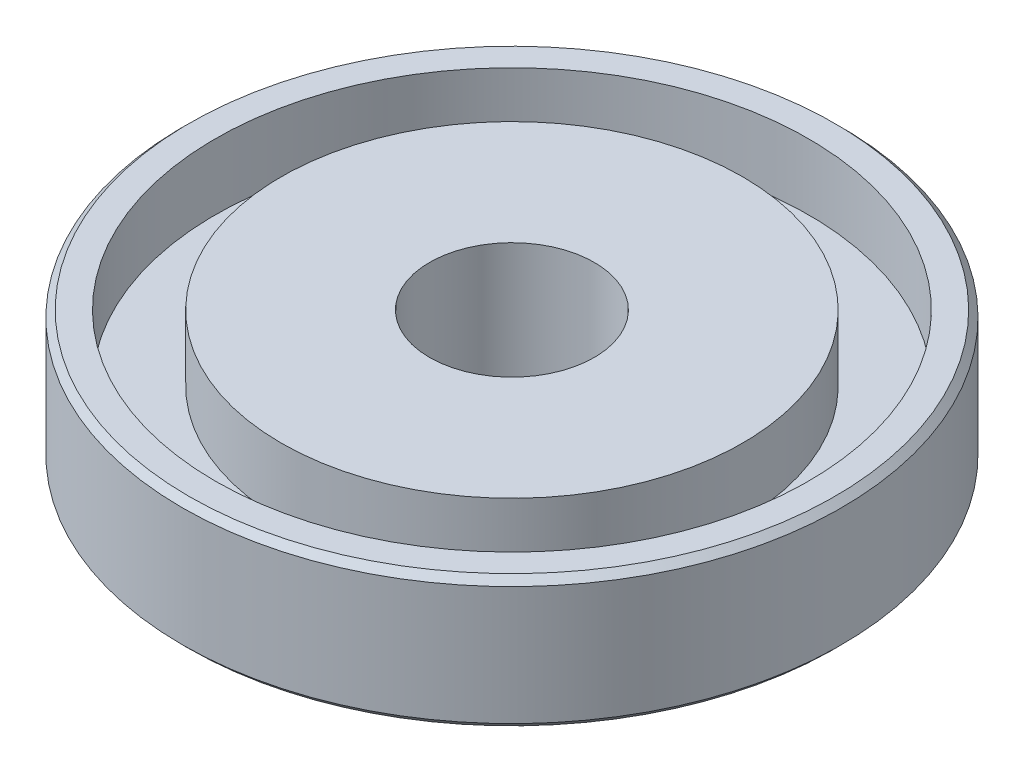
ISO-10303-21;
HEADER;
FILE_DESCRIPTION(('STEP AP214'),'2;1');
FILE_NAME('part.step','',(''),(''),'','','');
FILE_SCHEMA(('AUTOMOTIVE_DESIGN { 1 0 10303 214 1 1 1 1 }'));
ENDSEC;
DATA;
#1=APPLICATION_CONTEXT('core data for automotive mechanical design processes');
#2=APPLICATION_PROTOCOL_DEFINITION('international standard','automotive_design',2000,#1);
#3=PRODUCT_CONTEXT('',#1,'mechanical');
#4=PRODUCT('Part','Part','',(#3));
#5=PRODUCT_RELATED_PRODUCT_CATEGORY('part','',(#4));
#6=PRODUCT_DEFINITION_FORMATION('','',#4);
#7=PRODUCT_DEFINITION_CONTEXT('part definition',#1,'design');
#8=PRODUCT_DEFINITION('design','',#6,#7);
#9=PRODUCT_DEFINITION_SHAPE('','',#8);
#10=(LENGTH_UNIT() NAMED_UNIT(*) SI_UNIT(.MILLI.,.METRE.));
#11=(NAMED_UNIT(*) PLANE_ANGLE_UNIT() SI_UNIT($,.RADIAN.));
#12=(NAMED_UNIT(*) SI_UNIT($,.STERADIAN.) SOLID_ANGLE_UNIT());
#13=UNCERTAINTY_MEASURE_WITH_UNIT(LENGTH_MEASURE(1.E-05),#10,'distance_accuracy_value','');
#14=(GEOMETRIC_REPRESENTATION_CONTEXT(3) GLOBAL_UNCERTAINTY_ASSIGNED_CONTEXT((#13)) GLOBAL_UNIT_ASSIGNED_CONTEXT((#10,
#11,#12)) REPRESENTATION_CONTEXT('',''));
#15=CARTESIAN_POINT('',(0.,0.,0.));
#16=DIRECTION('',(0.,0.,1.));
#17=DIRECTION('',(1.,0.,0.));
#18=AXIS2_PLACEMENT_3D('',#15,#16,#17);
#19=CARTESIAN_POINT('',(0.,20.,0.));
#20=DIRECTION('',(0.,-1.,0.));
#21=DIRECTION('',(0.,0.,-1.));
#22=AXIS2_PLACEMENT_3D('',#19,#20,#21);
#23=CYLINDRICAL_SURFACE('',#22,50.);
#24=CARTESIAN_POINT('',(0.,1.,0.));
#25=DIRECTION('',(0.,1.,0.));
#26=DIRECTION('',(0.,0.,1.));
#27=AXIS2_PLACEMENT_3D('',#24,#25,#26);
#28=CIRCLE('',#27,50.);
#29=CARTESIAN_POINT('',(0.,1.,50.));
#30=VERTEX_POINT('',#29);
#31=EDGE_CURVE('E67',#30,#30,#28,.T.);
#32=ORIENTED_EDGE('',*,*,#31,.T.);
#33=EDGE_LOOP('',(#32));
#34=FACE_BOUND('',#33,.T.);
#35=CARTESIAN_POINT('',(0.,19.,0.));
#36=DIRECTION('',(0.,1.,0.));
#37=DIRECTION('',(0.,0.,1.));
#38=AXIS2_PLACEMENT_3D('',#35,#36,#37);
#39=CIRCLE('',#38,50.);
#40=CARTESIAN_POINT('',(0.,19.,50.));
#41=VERTEX_POINT('',#40);
#42=EDGE_CURVE('E73',#41,#41,#39,.F.);
#43=ORIENTED_EDGE('',*,*,#42,.T.);
#44=EDGE_LOOP('',(#43));
#45=FACE_BOUND('',#44,.T.);
#46=ADVANCED_FACE('F51',(#34,#45),#23,.T.);
#47=CARTESIAN_POINT('',(0.,20.,0.));
#48=DIRECTION('',(0.,1.,0.));
#49=DIRECTION('',(0.,0.,1.));
#50=AXIS2_PLACEMENT_3D('',#47,#48,#49);
#51=PLANE('',#50);
#52=CARTESIAN_POINT('',(0.,20.,0.));
#53=DIRECTION('',(0.,1.,0.));
#54=DIRECTION('',(0.,0.,1.));
#55=AXIS2_PLACEMENT_3D('',#52,#53,#54);
#56=CIRCLE('',#55,49.);
#57=CARTESIAN_POINT('',(0.,20.,49.));
#58=VERTEX_POINT('',#57);
#59=EDGE_CURVE('E10',#58,#58,#56,.T.);
#60=ORIENTED_EDGE('',*,*,#59,.T.);
#61=EDGE_LOOP('',(#60));
#62=FACE_BOUND('',#61,.T.);
#63=CARTESIAN_POINT('',(0.,20.,0.));
#64=DIRECTION('',(0.,1.,0.));
#65=DIRECTION('',(0.,0.,1.));
#66=AXIS2_PLACEMENT_3D('',#63,#64,#65);
#67=CIRCLE('',#66,45.);
#68=CARTESIAN_POINT('',(0.,20.,45.));
#69=VERTEX_POINT('',#68);
#70=EDGE_CURVE('E80',#69,#69,#67,.T.);
#71=ORIENTED_EDGE('',*,*,#70,.F.);
#72=EDGE_LOOP('',(#71));
#73=FACE_BOUND('',#72,.T.);
#74=ADVANCED_FACE('F109',(#62,#73),#51,.T.);
#75=CARTESIAN_POINT('',(0.,0.,0.));
#76=DIRECTION('',(0.,1.,0.));
#77=DIRECTION('',(0.,0.,1.));
#78=AXIS2_PLACEMENT_3D('',#75,#76,#77);
#79=PLANE('',#78);
#80=CARTESIAN_POINT('',(0.,0.,0.));
#81=DIRECTION('',(0.,1.,0.));
#82=DIRECTION('',(0.,0.,1.));
#83=AXIS2_PLACEMENT_3D('',#80,#81,#82);
#84=CIRCLE('',#83,49.);
#85=CARTESIAN_POINT('',(0.,0.,49.));
#86=VERTEX_POINT('',#85);
#87=EDGE_CURVE('E60',#86,#86,#84,.F.);
#88=ORIENTED_EDGE('',*,*,#87,.T.);
#89=EDGE_LOOP('',(#88));
#90=FACE_BOUND('',#89,.T.);
#91=CARTESIAN_POINT('',(0.,0.,0.));
#92=DIRECTION('',(0.,1.,0.));
#93=DIRECTION('',(0.,0.,1.));
#94=AXIS2_PLACEMENT_3D('',#91,#92,#93);
#95=CIRCLE('',#94,12.5);
#96=CARTESIAN_POINT('',(0.,0.,12.5));
#97=VERTEX_POINT('',#96);
#98=EDGE_CURVE('E94',#97,#97,#95,.T.);
#99=ORIENTED_EDGE('',*,*,#98,.T.);
#100=EDGE_LOOP('',(#99));
#101=FACE_BOUND('',#100,.T.);
#102=ADVANCED_FACE('F128',(#90,#101),#79,.F.);
#103=CARTESIAN_POINT('',(0.,10.,0.));
#104=DIRECTION('',(0.,1.,0.));
#105=DIRECTION('',(0.,0.,1.));
#106=AXIS2_PLACEMENT_3D('',#103,#104,#105);
#107=CYLINDRICAL_SURFACE('',#106,45.);
#108=CARTESIAN_POINT('',(0.,10.,0.));
#109=DIRECTION('',(0.,1.,0.));
#110=DIRECTION('',(0.,0.,1.));
#111=AXIS2_PLACEMENT_3D('',#108,#109,#110);
#112=CIRCLE('',#111,45.);
#113=CARTESIAN_POINT('',(0.,10.,45.));
#114=VERTEX_POINT('',#113);
#115=EDGE_CURVE('E79',#114,#114,#112,.T.);
#116=ORIENTED_EDGE('',*,*,#115,.F.);
#117=EDGE_LOOP('',(#116));
#118=FACE_BOUND('',#117,.T.);
#119=ORIENTED_EDGE('',*,*,#70,.T.);
#120=EDGE_LOOP('',(#119));
#121=FACE_BOUND('',#120,.T.);
#122=ADVANCED_FACE('F118',(#118,#121),#107,.F.);
#123=CARTESIAN_POINT('',(0.,10.,0.));
#124=DIRECTION('',(0.,1.,0.));
#125=DIRECTION('',(0.,0.,1.));
#126=AXIS2_PLACEMENT_3D('',#123,#124,#125);
#127=PLANE('',#126);
#128=CARTESIAN_POINT('',(0.,10.,0.));
#129=DIRECTION('',(0.,1.,0.));
#130=DIRECTION('',(0.,0.,1.));
#131=AXIS2_PLACEMENT_3D('',#128,#129,#130);
#132=CIRCLE('',#131,35.);
#133=CARTESIAN_POINT('',(0.,10.,35.));
#134=VERTEX_POINT('',#133);
#135=EDGE_CURVE('E83',#134,#134,#132,.T.);
#136=ORIENTED_EDGE('',*,*,#135,.F.);
#137=EDGE_LOOP('',(#136));
#138=FACE_BOUND('',#137,.T.);
#139=ORIENTED_EDGE('',*,*,#115,.T.);
#140=EDGE_LOOP('',(#139));
#141=FACE_BOUND('',#140,.T.);
#142=ADVANCED_FACE('F113',(#138,#141),#127,.T.);
#143=CARTESIAN_POINT('',(0.,10.,0.));
#144=DIRECTION('',(0.,1.,0.));
#145=DIRECTION('',(0.,0.,1.));
#146=AXIS2_PLACEMENT_3D('',#143,#144,#145);
#147=CYLINDRICAL_SURFACE('',#146,35.);
#148=ORIENTED_EDGE('',*,*,#135,.T.);
#149=EDGE_LOOP('',(#148));
#150=FACE_BOUND('',#149,.T.);
#151=CARTESIAN_POINT('',(0.,20.,0.));
#152=DIRECTION('',(0.,1.,0.));
#153=DIRECTION('',(0.,0.,1.));
#154=AXIS2_PLACEMENT_3D('',#151,#152,#153);
#155=CIRCLE('',#154,35.);
#156=CARTESIAN_POINT('',(0.,20.,35.));
#157=VERTEX_POINT('',#156);
#158=EDGE_CURVE('E86',#157,#157,#155,.T.);
#159=ORIENTED_EDGE('',*,*,#158,.F.);
#160=EDGE_LOOP('',(#159));
#161=FACE_BOUND('',#160,.T.);
#162=ADVANCED_FACE('F107',(#150,#161),#147,.T.);
#163=CARTESIAN_POINT('',(0.,20.,0.));
#164=DIRECTION('',(0.,1.,0.));
#165=DIRECTION('',(0.,0.,1.));
#166=AXIS2_PLACEMENT_3D('',#163,#164,#165);
#167=CIRCLE('',#166,12.5);
#168=CARTESIAN_POINT('',(0.,20.,12.5));
#169=VERTEX_POINT('',#168);
#170=EDGE_CURVE('E90',#169,#169,#167,.T.);
#171=ORIENTED_EDGE('',*,*,#170,.F.);
#172=EDGE_LOOP('',(#171));
#173=FACE_BOUND('',#172,.T.);
#174=ORIENTED_EDGE('',*,*,#158,.T.);
#175=EDGE_LOOP('',(#174));
#176=FACE_BOUND('',#175,.T.);
#177=ADVANCED_FACE('F104',(#173,#176),#51,.T.);
#178=CARTESIAN_POINT('',(0.,20.,0.));
#179=DIRECTION('',(0.,-1.,0.));
#180=DIRECTION('',(0.,0.,-1.));
#181=AXIS2_PLACEMENT_3D('',#178,#179,#180);
#182=CYLINDRICAL_SURFACE('',#181,12.5);
#183=ORIENTED_EDGE('',*,*,#170,.T.);
#184=EDGE_LOOP('',(#183));
#185=FACE_BOUND('',#184,.T.);
#186=ORIENTED_EDGE('',*,*,#98,.F.);
#187=EDGE_LOOP('',(#186));
#188=FACE_BOUND('',#187,.T.);
#189=ADVANCED_FACE('F101',(#185,#188),#182,.F.);
#190=CARTESIAN_POINT('',(0.,1.,0.));
#191=DIRECTION('',(0.,1.,0.));
#192=DIRECTION('',(0.,0.,1.));
#193=AXIS2_PLACEMENT_3D('',#190,#191,#192);
#194=CONICAL_SURFACE('',#193,50.,0.785398163397445);
#195=ORIENTED_EDGE('',*,*,#87,.F.);
#196=EDGE_LOOP('',(#195));
#197=FACE_BOUND('',#196,.T.);
#198=ORIENTED_EDGE('',*,*,#31,.F.);
#199=EDGE_LOOP('',(#198));
#200=FACE_BOUND('',#199,.T.);
#201=ADVANCED_FACE('F135',(#197,#200),#194,.T.);
#202=CARTESIAN_POINT('',(0.,20.,0.));
#203=DIRECTION('',(0.,-1.,0.));
#204=DIRECTION('',(0.,0.,-1.));
#205=AXIS2_PLACEMENT_3D('',#202,#203,#204);
#206=CONICAL_SURFACE('',#205,49.,0.785398163397438);
#207=ORIENTED_EDGE('',*,*,#42,.F.);
#208=EDGE_LOOP('',(#207));
#209=FACE_BOUND('',#208,.T.);
#210=ORIENTED_EDGE('',*,*,#59,.F.);
#211=EDGE_LOOP('',(#210));
#212=FACE_BOUND('',#211,.T.);
#213=ADVANCED_FACE('F54',(#209,#212),#206,.T.);
#214=CLOSED_SHELL('',(#46,#74,#102,#122,#142,#162,#177,#189,#201,#213));
#215=MANIFOLD_SOLID_BREP('B2',#214);
#216=ADVANCED_BREP_SHAPE_REPRESENTATION('',(#18,#215),#14);
#217=SHAPE_DEFINITION_REPRESENTATION(#9,#216);
ENDSEC;
END-ISO-10303-21;
